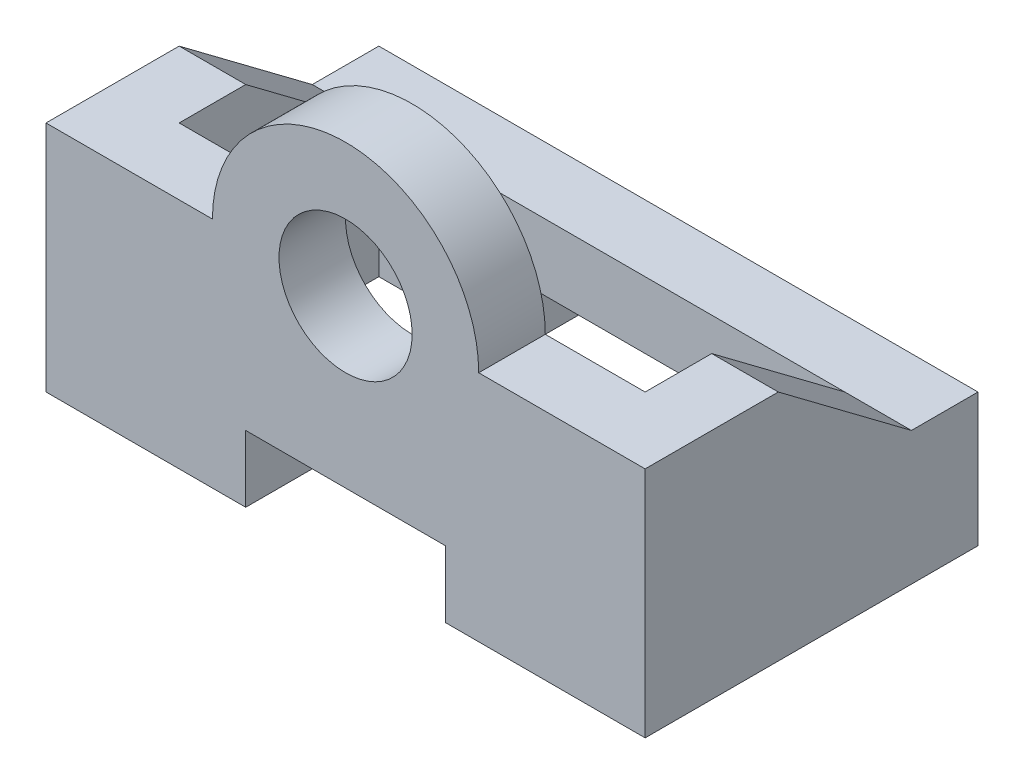
ISO-10303-21;
HEADER;
FILE_DESCRIPTION(('STEP AP214'),'2;1');
FILE_NAME('part.step','',(''),(''),'','','');
FILE_SCHEMA(('AUTOMOTIVE_DESIGN { 1 0 10303 214 1 1 1 1 }'));
ENDSEC;
DATA;
#1=APPLICATION_CONTEXT('core data for automotive mechanical design processes');
#2=APPLICATION_PROTOCOL_DEFINITION('international standard','automotive_design',2000,#1);
#3=PRODUCT_CONTEXT('',#1,'mechanical');
#4=PRODUCT('Part','Part','',(#3));
#5=PRODUCT_RELATED_PRODUCT_CATEGORY('part','',(#4));
#6=PRODUCT_DEFINITION_FORMATION('','',#4);
#7=PRODUCT_DEFINITION_CONTEXT('part definition',#1,'design');
#8=PRODUCT_DEFINITION('design','',#6,#7);
#9=PRODUCT_DEFINITION_SHAPE('','',#8);
#10=(LENGTH_UNIT() NAMED_UNIT(*) SI_UNIT(.MILLI.,.METRE.));
#11=(NAMED_UNIT(*) PLANE_ANGLE_UNIT() SI_UNIT($,.RADIAN.));
#12=(NAMED_UNIT(*) SI_UNIT($,.STERADIAN.) SOLID_ANGLE_UNIT());
#13=UNCERTAINTY_MEASURE_WITH_UNIT(LENGTH_MEASURE(1.E-05),#10,'distance_accuracy_value','');
#14=(GEOMETRIC_REPRESENTATION_CONTEXT(3) GLOBAL_UNCERTAINTY_ASSIGNED_CONTEXT((#13)) GLOBAL_UNIT_ASSIGNED_CONTEXT((#10,
#11,#12)) REPRESENTATION_CONTEXT('',''));
#15=CARTESIAN_POINT('',(0.,0.,0.));
#16=DIRECTION('',(0.,0.,1.));
#17=DIRECTION('',(1.,0.,0.));
#18=AXIS2_PLACEMENT_3D('',#15,#16,#17);
#19=CARTESIAN_POINT('',(35.,0.,-25.));
#20=DIRECTION('',(1.,0.,0.));
#21=DIRECTION('',(0.,0.,-1.));
#22=AXIS2_PLACEMENT_3D('',#19,#20,#21);
#23=PLANE('',#22);
#24=DIRECTION('',(0.,-1.,0.));
#25=VECTOR('',#24,1.);
#26=CARTESIAN_POINT('',(35.,0.,15.));
#27=LINE('',#26,#25);
#28=CARTESIAN_POINT('',(35.,7.5,15.));
#29=VERTEX_POINT('',#28);
#30=CARTESIAN_POINT('',(35.,-27.5,15.));
#31=VERTEX_POINT('',#30);
#32=EDGE_CURVE('E11',#29,#31,#27,.T.);
#33=ORIENTED_EDGE('',*,*,#32,.F.);
#34=DIRECTION('',(0.,0.,1.));
#35=VECTOR('',#34,1.);
#36=CARTESIAN_POINT('',(35.,7.49999999999999,25.));
#37=LINE('',#36,#35);
#38=CARTESIAN_POINT('',(35.,7.49999999999999,5.));
#39=VERTEX_POINT('',#38);
#40=EDGE_CURVE('E132',#39,#29,#37,.T.);
#41=ORIENTED_EDGE('',*,*,#40,.F.);
#42=DIRECTION('',(0.,0.6,0.8));
#43=VECTOR('',#42,1.);
#44=CARTESIAN_POINT('',(35.,7.49999999999999,5.));
#45=LINE('',#44,#43);
#46=CARTESIAN_POINT('',(35.,-7.5,-15.));
#47=VERTEX_POINT('',#46);
#48=EDGE_CURVE('E76',#47,#39,#45,.T.);
#49=ORIENTED_EDGE('',*,*,#48,.F.);
#50=DIRECTION('',(0.,1.,0.));
#51=VECTOR('',#50,1.);
#52=CARTESIAN_POINT('',(35.,0.,-15.));
#53=LINE('',#52,#51);
#54=CARTESIAN_POINT('',(35.,-27.5,-15.));
#55=VERTEX_POINT('',#54);
#56=EDGE_CURVE('E49',#55,#47,#53,.T.);
#57=ORIENTED_EDGE('',*,*,#56,.F.);
#58=DIRECTION('',(0.,0.,-1.));
#59=VECTOR('',#58,1.);
#60=CARTESIAN_POINT('',(35.,-27.5,-25.));
#61=LINE('',#60,#59);
#62=EDGE_CURVE('E136',#31,#55,#61,.T.);
#63=ORIENTED_EDGE('',*,*,#62,.F.);
#64=EDGE_LOOP('',(#33,#41,#49,#57,#63));
#65=FACE_BOUND('',#64,.T.);
#66=ADVANCED_FACE('F41',(#65),#23,.F.);
#67=CARTESIAN_POINT('',(45.,-27.5,-25.));
#68=DIRECTION('',(0.,0.,1.));
#69=DIRECTION('',(1.,0.,0.));
#70=AXIS2_PLACEMENT_3D('',#67,#68,#69);
#71=PLANE('',#70);
#72=DIRECTION('',(-1.,0.,0.));
#73=VECTOR('',#72,1.);
#74=CARTESIAN_POINT('',(45.,-27.5,-25.));
#75=LINE('',#74,#73);
#76=CARTESIAN_POINT('',(45.,-27.5,-25.));
#77=VERTEX_POINT('',#76);
#78=CARTESIAN_POINT('',(15.,-27.5,-25.));
#79=VERTEX_POINT('',#78);
#80=EDGE_CURVE('E127',#77,#79,#75,.T.);
#81=ORIENTED_EDGE('',*,*,#80,.T.);
#82=DIRECTION('',(0.,-1.,0.));
#83=VECTOR('',#82,1.);
#84=CARTESIAN_POINT('',(15.,-27.5,-25.));
#85=LINE('',#84,#83);
#86=CARTESIAN_POINT('',(15.,-17.5,-25.));
#87=VERTEX_POINT('',#86);
#88=EDGE_CURVE('E169',#87,#79,#85,.T.);
#89=ORIENTED_EDGE('',*,*,#88,.F.);
#90=DIRECTION('',(1.,0.,0.));
#91=VECTOR('',#90,1.);
#92=CARTESIAN_POINT('',(-15.,-17.5,-25.));
#93=LINE('',#92,#91);
#94=CARTESIAN_POINT('',(-15.,-17.5,-25.));
#95=VERTEX_POINT('',#94);
#96=EDGE_CURVE('E175',#95,#87,#93,.T.);
#97=ORIENTED_EDGE('',*,*,#96,.F.);
#98=DIRECTION('',(0.,1.,0.));
#99=VECTOR('',#98,1.);
#100=CARTESIAN_POINT('',(-15.,-27.5,-25.));
#101=LINE('',#100,#99);
#102=CARTESIAN_POINT('',(-15.,-27.5,-25.));
#103=VERTEX_POINT('',#102);
#104=EDGE_CURVE('E187',#103,#95,#101,.T.);
#105=ORIENTED_EDGE('',*,*,#104,.F.);
#106=DIRECTION('',(-1.,0.,0.));
#107=VECTOR('',#106,1.);
#108=CARTESIAN_POINT('',(-35.,-27.5,-25.));
#109=LINE('',#108,#107);
#110=CARTESIAN_POINT('',(-45.,-27.5,-25.));
#111=VERTEX_POINT('',#110);
#112=EDGE_CURVE('E216',#103,#111,#109,.T.);
#113=ORIENTED_EDGE('',*,*,#112,.T.);
#114=DIRECTION('',(0.,1.,0.));
#115=VECTOR('',#114,1.);
#116=CARTESIAN_POINT('',(-45.,-27.5,-25.));
#117=LINE('',#116,#115);
#118=CARTESIAN_POINT('',(-45.,-7.5,-25.));
#119=VERTEX_POINT('',#118);
#120=EDGE_CURVE('E205',#111,#119,#117,.T.);
#121=ORIENTED_EDGE('',*,*,#120,.T.);
#122=DIRECTION('',(-1.,0.,0.));
#123=VECTOR('',#122,1.);
#124=CARTESIAN_POINT('',(45.,-7.5,-25.));
#125=LINE('',#124,#123);
#126=CARTESIAN_POINT('',(45.,-7.5,-25.));
#127=VERTEX_POINT('',#126);
#128=EDGE_CURVE('E145',#127,#119,#125,.T.);
#129=ORIENTED_EDGE('',*,*,#128,.F.);
#130=DIRECTION('',(0.,1.,0.));
#131=VECTOR('',#130,1.);
#132=CARTESIAN_POINT('',(45.,-27.5,-25.));
#133=LINE('',#132,#131);
#134=EDGE_CURVE('E138',#77,#127,#133,.T.);
#135=ORIENTED_EDGE('',*,*,#134,.F.);
#136=EDGE_LOOP('',(#81,#89,#97,#105,#113,#121,#129,#135));
#137=FACE_BOUND('',#136,.T.);
#138=ADVANCED_FACE('F43',(#137),#71,.F.);
#139=CARTESIAN_POINT('',(45.,-7.5,-25.));
#140=DIRECTION('',(0.,-1.,0.));
#141=DIRECTION('',(0.,0.,-1.));
#142=AXIS2_PLACEMENT_3D('',#139,#140,#141);
#143=PLANE('',#142);
#144=ORIENTED_EDGE('',*,*,#128,.T.);
#145=DIRECTION('',(0.,0.,1.));
#146=VECTOR('',#145,1.);
#147=CARTESIAN_POINT('',(-45.,-7.5,-25.));
#148=LINE('',#147,#146);
#149=CARTESIAN_POINT('',(-45.,-7.5,-15.));
#150=VERTEX_POINT('',#149);
#151=EDGE_CURVE('E219',#119,#150,#148,.T.);
#152=ORIENTED_EDGE('',*,*,#151,.T.);
#153=DIRECTION('',(-1.,0.,0.));
#154=VECTOR('',#153,1.);
#155=CARTESIAN_POINT('',(-35.,-7.5,-15.));
#156=LINE('',#155,#154);
#157=CARTESIAN_POINT('',(-35.,-7.5,-15.));
#158=VERTEX_POINT('',#157);
#159=EDGE_CURVE('E166',#158,#150,#156,.T.);
#160=ORIENTED_EDGE('',*,*,#159,.F.);
#161=DIRECTION('',(-1.,0.,0.));
#162=VECTOR('',#161,1.);
#163=CARTESIAN_POINT('',(-45.,-7.5,-15.));
#164=LINE('',#163,#162);
#165=EDGE_CURVE('E154',#47,#158,#164,.T.);
#166=ORIENTED_EDGE('',*,*,#165,.F.);
#167=DIRECTION('',(-1.,0.,0.));
#168=VECTOR('',#167,1.);
#169=CARTESIAN_POINT('',(45.,-7.5,-15.));
#170=LINE('',#169,#168);
#171=CARTESIAN_POINT('',(45.,-7.5,-15.));
#172=VERTEX_POINT('',#171);
#173=EDGE_CURVE('E143',#172,#47,#170,.T.);
#174=ORIENTED_EDGE('',*,*,#173,.F.);
#175=DIRECTION('',(0.,0.,1.));
#176=VECTOR('',#175,1.);
#177=CARTESIAN_POINT('',(45.,-7.5,-25.));
#178=LINE('',#177,#176);
#179=EDGE_CURVE('E300',#127,#172,#178,.T.);
#180=ORIENTED_EDGE('',*,*,#179,.F.);
#181=EDGE_LOOP('',(#144,#152,#160,#166,#174,#180));
#182=FACE_BOUND('',#181,.T.);
#183=ADVANCED_FACE('F163',(#182),#143,.F.);
#184=CARTESIAN_POINT('',(45.,7.49999999999999,5.));
#185=DIRECTION('',(0.,-0.8,0.6));
#186=DIRECTION('',(0.,-0.6,-0.8));
#187=AXIS2_PLACEMENT_3D('',#184,#185,#186);
#188=PLANE('',#187);
#189=ORIENTED_EDGE('',*,*,#48,.T.);
#190=DIRECTION('',(-1.,0.,0.));
#191=VECTOR('',#190,1.);
#192=CARTESIAN_POINT('',(45.,7.49999999999999,5.));
#193=LINE('',#192,#191);
#194=CARTESIAN_POINT('',(45.,7.49999999999999,5.));
#195=VERTEX_POINT('',#194);
#196=EDGE_CURVE('E119',#195,#39,#193,.T.);
#197=ORIENTED_EDGE('',*,*,#196,.F.);
#198=DIRECTION('',(0.,0.6,0.8));
#199=VECTOR('',#198,1.);
#200=CARTESIAN_POINT('',(45.,7.49999999999999,5.));
#201=LINE('',#200,#199);
#202=EDGE_CURVE('E105',#172,#195,#201,.T.);
#203=ORIENTED_EDGE('',*,*,#202,.F.);
#204=ORIENTED_EDGE('',*,*,#173,.T.);
#205=EDGE_LOOP('',(#189,#197,#203,#204));
#206=FACE_BOUND('',#205,.T.);
#207=ADVANCED_FACE('F405',(#206),#188,.F.);
#208=CARTESIAN_POINT('',(45.,7.49999999999999,25.));
#209=DIRECTION('',(0.,-1.,0.));
#210=DIRECTION('',(0.,0.,-1.));
#211=AXIS2_PLACEMENT_3D('',#208,#209,#210);
#212=PLANE('',#211);
#213=DIRECTION('',(-1.,0.,0.));
#214=VECTOR('',#213,1.);
#215=CARTESIAN_POINT('',(45.,7.49999999999999,25.));
#216=LINE('',#215,#214);
#217=CARTESIAN_POINT('',(45.,7.49999999999999,25.));
#218=VERTEX_POINT('',#217);
#219=CARTESIAN_POINT('',(20.,7.5,25.));
#220=VERTEX_POINT('',#219);
#221=EDGE_CURVE('E110',#218,#220,#216,.T.);
#222=ORIENTED_EDGE('',*,*,#221,.F.);
#223=DIRECTION('',(0.,0.,1.));
#224=VECTOR('',#223,1.);
#225=CARTESIAN_POINT('',(45.,7.49999999999999,25.));
#226=LINE('',#225,#224);
#227=EDGE_CURVE('E98',#195,#218,#226,.T.);
#228=ORIENTED_EDGE('',*,*,#227,.F.);
#229=ORIENTED_EDGE('',*,*,#196,.T.);
#230=ORIENTED_EDGE('',*,*,#40,.T.);
#231=DIRECTION('',(1.,0.,0.));
#232=VECTOR('',#231,1.);
#233=CARTESIAN_POINT('',(0.,7.5,15.));
#234=LINE('',#233,#232);
#235=CARTESIAN_POINT('',(20.,7.5,15.));
#236=VERTEX_POINT('',#235);
#237=EDGE_CURVE('E236',#236,#29,#234,.T.);
#238=ORIENTED_EDGE('',*,*,#237,.F.);
#239=DIRECTION('',(0.,0.,1.));
#240=VECTOR('',#239,1.);
#241=CARTESIAN_POINT('',(20.,7.5,15.));
#242=LINE('',#241,#240);
#243=EDGE_CURVE('E115',#236,#220,#242,.T.);
#244=ORIENTED_EDGE('',*,*,#243,.T.);
#245=EDGE_LOOP('',(#222,#228,#229,#230,#238,#244));
#246=FACE_BOUND('',#245,.T.);
#247=ADVANCED_FACE('F111',(#246),#212,.F.);
#248=CARTESIAN_POINT('',(45.,-27.5,25.));
#249=DIRECTION('',(0.,0.,-1.));
#250=DIRECTION('',(-1.,0.,0.));
#251=AXIS2_PLACEMENT_3D('',#248,#249,#250);
#252=PLANE('',#251);
#253=ORIENTED_EDGE('',*,*,#221,.T.);
#254=CARTESIAN_POINT('',(0.,7.5,25.));
#255=DIRECTION('',(0.,0.,1.));
#256=DIRECTION('',(1.,0.,0.));
#257=AXIS2_PLACEMENT_3D('',#254,#255,#256);
#258=CIRCLE('',#257,20.);
#259=CARTESIAN_POINT('',(-20.,7.5,25.));
#260=VERTEX_POINT('',#259);
#261=EDGE_CURVE('E259',#220,#260,#258,.T.);
#262=ORIENTED_EDGE('',*,*,#261,.T.);
#263=DIRECTION('',(1.,0.,0.));
#264=VECTOR('',#263,1.);
#265=CARTESIAN_POINT('',(0.,7.5,25.));
#266=LINE('',#265,#264);
#267=CARTESIAN_POINT('',(-45.,7.5,25.));
#268=VERTEX_POINT('',#267);
#269=EDGE_CURVE('E260',#268,#260,#266,.T.);
#270=ORIENTED_EDGE('',*,*,#269,.F.);
#271=DIRECTION('',(0.,1.,0.));
#272=VECTOR('',#271,1.);
#273=CARTESIAN_POINT('',(-45.,0.,25.));
#274=LINE('',#273,#272);
#275=CARTESIAN_POINT('',(-45.,-27.5,25.));
#276=VERTEX_POINT('',#275);
#277=EDGE_CURVE('E263',#276,#268,#274,.T.);
#278=ORIENTED_EDGE('',*,*,#277,.F.);
#279=DIRECTION('',(-1.,0.,0.));
#280=VECTOR('',#279,1.);
#281=CARTESIAN_POINT('',(0.,-27.5,25.));
#282=LINE('',#281,#280);
#283=CARTESIAN_POINT('',(-15.,-27.5,25.));
#284=VERTEX_POINT('',#283);
#285=EDGE_CURVE('E267',#284,#276,#282,.T.);
#286=ORIENTED_EDGE('',*,*,#285,.F.);
#287=DIRECTION('',(0.,-1.,0.));
#288=VECTOR('',#287,1.);
#289=CARTESIAN_POINT('',(-15.,0.,25.));
#290=LINE('',#289,#288);
#291=CARTESIAN_POINT('',(-15.,-17.5,25.));
#292=VERTEX_POINT('',#291);
#293=EDGE_CURVE('E270',#292,#284,#290,.T.);
#294=ORIENTED_EDGE('',*,*,#293,.F.);
#295=DIRECTION('',(-1.,0.,0.));
#296=VECTOR('',#295,1.);
#297=CARTESIAN_POINT('',(0.,-17.5,25.));
#298=LINE('',#297,#296);
#299=CARTESIAN_POINT('',(15.,-17.5,25.));
#300=VERTEX_POINT('',#299);
#301=EDGE_CURVE('E273',#300,#292,#298,.T.);
#302=ORIENTED_EDGE('',*,*,#301,.F.);
#303=DIRECTION('',(0.,1.,0.));
#304=VECTOR('',#303,1.);
#305=CARTESIAN_POINT('',(15.,0.,25.));
#306=LINE('',#305,#304);
#307=CARTESIAN_POINT('',(15.,-27.5,25.));
#308=VERTEX_POINT('',#307);
#309=EDGE_CURVE('E237',#308,#300,#306,.T.);
#310=ORIENTED_EDGE('',*,*,#309,.F.);
#311=DIRECTION('',(-1.,0.,0.));
#312=VECTOR('',#311,1.);
#313=CARTESIAN_POINT('',(45.,-27.5,25.));
#314=LINE('',#313,#312);
#315=CARTESIAN_POINT('',(45.,-27.5,25.));
#316=VERTEX_POINT('',#315);
#317=EDGE_CURVE('E120',#316,#308,#314,.T.);
#318=ORIENTED_EDGE('',*,*,#317,.F.);
#319=DIRECTION('',(0.,-1.,0.));
#320=VECTOR('',#319,1.);
#321=CARTESIAN_POINT('',(45.,-27.5,25.));
#322=LINE('',#321,#320);
#323=EDGE_CURVE('E102',#218,#316,#322,.T.);
#324=ORIENTED_EDGE('',*,*,#323,.F.);
#325=EDGE_LOOP('',(#253,#262,#270,#278,#286,#294,#302,#310,#318,#324));
#326=FACE_BOUND('',#325,.T.);
#327=CARTESIAN_POINT('',(0.,7.5,25.));
#328=DIRECTION('',(0.,0.,1.));
#329=DIRECTION('',(1.,0.,0.));
#330=AXIS2_PLACEMENT_3D('',#327,#328,#329);
#331=CIRCLE('',#330,10.);
#332=CARTESIAN_POINT('',(10.,7.5,25.));
#333=VERTEX_POINT('',#332);
#334=EDGE_CURVE('E232',#333,#333,#331,.T.);
#335=ORIENTED_EDGE('',*,*,#334,.F.);
#336=EDGE_LOOP('',(#335));
#337=FACE_BOUND('',#336,.T.);
#338=ADVANCED_FACE('F122',(#326,#337),#252,.F.);
#339=CARTESIAN_POINT('',(45.,-27.5,-25.));
#340=DIRECTION('',(0.,1.,0.));
#341=DIRECTION('',(0.,0.,1.));
#342=AXIS2_PLACEMENT_3D('',#339,#340,#341);
#343=PLANE('',#342);
#344=ORIENTED_EDGE('',*,*,#80,.F.);
#345=DIRECTION('',(0.,0.,-1.));
#346=VECTOR('',#345,1.);
#347=CARTESIAN_POINT('',(45.,-27.5,-25.));
#348=LINE('',#347,#346);
#349=EDGE_CURVE('E64',#316,#77,#348,.T.);
#350=ORIENTED_EDGE('',*,*,#349,.F.);
#351=ORIENTED_EDGE('',*,*,#317,.T.);
#352=DIRECTION('',(0.,0.,1.));
#353=VECTOR('',#352,1.);
#354=CARTESIAN_POINT('',(15.,-27.5,15.));
#355=LINE('',#354,#353);
#356=CARTESIAN_POINT('',(15.,-27.5,15.));
#357=VERTEX_POINT('',#356);
#358=EDGE_CURVE('E133',#357,#308,#355,.T.);
#359=ORIENTED_EDGE('',*,*,#358,.F.);
#360=DIRECTION('',(-1.,0.,0.));
#361=VECTOR('',#360,1.);
#362=CARTESIAN_POINT('',(0.,-27.5,15.));
#363=LINE('',#362,#361);
#364=EDGE_CURVE('E255',#31,#357,#363,.T.);
#365=ORIENTED_EDGE('',*,*,#364,.F.);
#366=ORIENTED_EDGE('',*,*,#62,.T.);
#367=DIRECTION('',(1.,0.,0.));
#368=VECTOR('',#367,1.);
#369=CARTESIAN_POINT('',(45.,-27.5,-15.));
#370=LINE('',#369,#368);
#371=CARTESIAN_POINT('',(15.,-27.5,-15.));
#372=VERTEX_POINT('',#371);
#373=EDGE_CURVE('E158',#372,#55,#370,.T.);
#374=ORIENTED_EDGE('',*,*,#373,.F.);
#375=DIRECTION('',(0.,0.,-1.));
#376=VECTOR('',#375,1.);
#377=CARTESIAN_POINT('',(15.,-27.5,-15.));
#378=LINE('',#377,#376);
#379=EDGE_CURVE('E186',#372,#79,#378,.T.);
#380=ORIENTED_EDGE('',*,*,#379,.T.);
#381=EDGE_LOOP('',(#344,#350,#351,#359,#365,#366,#374,#380));
#382=FACE_BOUND('',#381,.T.);
#383=ADVANCED_FACE('F421',(#382),#343,.F.);
#384=CARTESIAN_POINT('',(45.,0.,-25.));
#385=DIRECTION('',(1.,0.,0.));
#386=DIRECTION('',(0.,0.,-1.));
#387=AXIS2_PLACEMENT_3D('',#384,#385,#386);
#388=PLANE('',#387);
#389=ORIENTED_EDGE('',*,*,#179,.T.);
#390=ORIENTED_EDGE('',*,*,#202,.T.);
#391=ORIENTED_EDGE('',*,*,#227,.T.);
#392=ORIENTED_EDGE('',*,*,#323,.T.);
#393=ORIENTED_EDGE('',*,*,#349,.T.);
#394=ORIENTED_EDGE('',*,*,#134,.T.);
#395=EDGE_LOOP('',(#389,#390,#391,#392,#393,#394));
#396=FACE_BOUND('',#395,.T.);
#397=ADVANCED_FACE('F100',(#396),#388,.T.);
#398=CARTESIAN_POINT('',(0.,0.,15.));
#399=DIRECTION('',(0.,0.,1.));
#400=DIRECTION('',(1.,0.,0.));
#401=AXIS2_PLACEMENT_3D('',#398,#399,#400);
#402=PLANE('',#401);
#403=CARTESIAN_POINT('',(0.,7.5,15.));
#404=DIRECTION('',(0.,0.,1.));
#405=DIRECTION('',(1.,0.,0.));
#406=AXIS2_PLACEMENT_3D('',#403,#404,#405);
#407=CIRCLE('',#406,10.);
#408=CARTESIAN_POINT('',(10.,7.5,15.));
#409=VERTEX_POINT('',#408);
#410=EDGE_CURVE('E233',#409,#409,#407,.T.);
#411=ORIENTED_EDGE('',*,*,#410,.T.);
#412=EDGE_LOOP('',(#411));
#413=FACE_BOUND('',#412,.T.);
#414=ORIENTED_EDGE('',*,*,#237,.T.);
#415=ORIENTED_EDGE('',*,*,#32,.T.);
#416=ORIENTED_EDGE('',*,*,#364,.T.);
#417=DIRECTION('',(0.,1.,0.));
#418=VECTOR('',#417,1.);
#419=CARTESIAN_POINT('',(15.,0.,15.));
#420=LINE('',#419,#418);
#421=CARTESIAN_POINT('',(15.,-17.5,15.));
#422=VERTEX_POINT('',#421);
#423=EDGE_CURVE('E252',#357,#422,#420,.T.);
#424=ORIENTED_EDGE('',*,*,#423,.T.);
#425=DIRECTION('',(-1.,0.,0.));
#426=VECTOR('',#425,1.);
#427=CARTESIAN_POINT('',(0.,-17.5,15.));
#428=LINE('',#427,#426);
#429=CARTESIAN_POINT('',(-15.,-17.5,15.));
#430=VERTEX_POINT('',#429);
#431=EDGE_CURVE('E249',#422,#430,#428,.T.);
#432=ORIENTED_EDGE('',*,*,#431,.T.);
#433=DIRECTION('',(0.,-1.,0.));
#434=VECTOR('',#433,1.);
#435=CARTESIAN_POINT('',(-15.,0.,15.));
#436=LINE('',#435,#434);
#437=CARTESIAN_POINT('',(-15.,-27.5,15.));
#438=VERTEX_POINT('',#437);
#439=EDGE_CURVE('E246',#430,#438,#436,.T.);
#440=ORIENTED_EDGE('',*,*,#439,.T.);
#441=DIRECTION('',(-1.,0.,0.));
#442=VECTOR('',#441,1.);
#443=CARTESIAN_POINT('',(0.,-27.5,15.));
#444=LINE('',#443,#442);
#445=CARTESIAN_POINT('',(-35.,-27.5,15.));
#446=VERTEX_POINT('',#445);
#447=EDGE_CURVE('E243',#438,#446,#444,.T.);
#448=ORIENTED_EDGE('',*,*,#447,.T.);
#449=DIRECTION('',(0.,1.,0.));
#450=VECTOR('',#449,1.);
#451=CARTESIAN_POINT('',(-35.,0.,15.));
#452=LINE('',#451,#450);
#453=CARTESIAN_POINT('',(-35.,7.5,15.));
#454=VERTEX_POINT('',#453);
#455=EDGE_CURVE('E229',#446,#454,#452,.T.);
#456=ORIENTED_EDGE('',*,*,#455,.T.);
#457=CARTESIAN_POINT('',(-20.,7.5,15.));
#458=VERTEX_POINT('',#457);
#459=EDGE_CURVE('E240',#454,#458,#234,.T.);
#460=ORIENTED_EDGE('',*,*,#459,.T.);
#461=CARTESIAN_POINT('',(0.,7.5,15.));
#462=DIRECTION('',(0.,0.,1.));
#463=DIRECTION('',(1.,0.,0.));
#464=AXIS2_PLACEMENT_3D('',#461,#462,#463);
#465=CIRCLE('',#464,20.);
#466=EDGE_CURVE('E239',#236,#458,#465,.T.);
#467=ORIENTED_EDGE('',*,*,#466,.F.);
#468=EDGE_LOOP('',(#414,#415,#416,#424,#432,#440,#448,#456,#460,#467));
#469=FACE_BOUND('',#468,.T.);
#470=ADVANCED_FACE('F386',(#413,#469),#402,.F.);
#471=CARTESIAN_POINT('',(0.,0.,-15.));
#472=DIRECTION('',(0.,0.,-1.));
#473=DIRECTION('',(-1.,0.,0.));
#474=AXIS2_PLACEMENT_3D('',#471,#472,#473);
#475=PLANE('',#474);
#476=ORIENTED_EDGE('',*,*,#373,.T.);
#477=ORIENTED_EDGE('',*,*,#56,.T.);
#478=ORIENTED_EDGE('',*,*,#165,.T.);
#479=DIRECTION('',(0.,1.,0.));
#480=VECTOR('',#479,1.);
#481=CARTESIAN_POINT('',(-35.,0.,-15.));
#482=LINE('',#481,#480);
#483=CARTESIAN_POINT('',(-35.,-27.5,-15.));
#484=VERTEX_POINT('',#483);
#485=EDGE_CURVE('E203',#484,#158,#482,.T.);
#486=ORIENTED_EDGE('',*,*,#485,.F.);
#487=DIRECTION('',(1.,0.,0.));
#488=VECTOR('',#487,1.);
#489=CARTESIAN_POINT('',(-45.,-27.5,-15.));
#490=LINE('',#489,#488);
#491=CARTESIAN_POINT('',(-15.,-27.5,-15.));
#492=VERTEX_POINT('',#491);
#493=EDGE_CURVE('E168',#484,#492,#490,.T.);
#494=ORIENTED_EDGE('',*,*,#493,.T.);
#495=DIRECTION('',(0.,1.,0.));
#496=VECTOR('',#495,1.);
#497=CARTESIAN_POINT('',(-15.,-27.5,-15.));
#498=LINE('',#497,#496);
#499=CARTESIAN_POINT('',(-15.,-17.5,-15.));
#500=VERTEX_POINT('',#499);
#501=EDGE_CURVE('E172',#492,#500,#498,.T.);
#502=ORIENTED_EDGE('',*,*,#501,.T.);
#503=DIRECTION('',(1.,0.,0.));
#504=VECTOR('',#503,1.);
#505=CARTESIAN_POINT('',(-15.,-17.5,-15.));
#506=LINE('',#505,#504);
#507=CARTESIAN_POINT('',(15.,-17.5,-15.));
#508=VERTEX_POINT('',#507);
#509=EDGE_CURVE('E180',#500,#508,#506,.T.);
#510=ORIENTED_EDGE('',*,*,#509,.T.);
#511=DIRECTION('',(0.,-1.,0.));
#512=VECTOR('',#511,1.);
#513=CARTESIAN_POINT('',(15.,-27.5,-15.));
#514=LINE('',#513,#512);
#515=EDGE_CURVE('E183',#508,#372,#514,.T.);
#516=ORIENTED_EDGE('',*,*,#515,.T.);
#517=EDGE_LOOP('',(#476,#477,#478,#486,#494,#502,#510,#516));
#518=FACE_BOUND('',#517,.T.);
#519=ADVANCED_FACE('F151',(#518),#475,.F.);
#520=CARTESIAN_POINT('',(15.,0.,15.));
#521=DIRECTION('',(1.,0.,0.));
#522=DIRECTION('',(0.,0.,-1.));
#523=AXIS2_PLACEMENT_3D('',#520,#521,#522);
#524=PLANE('',#523);
#525=ORIENTED_EDGE('',*,*,#309,.T.);
#526=DIRECTION('',(0.,0.,1.));
#527=VECTOR('',#526,1.);
#528=CARTESIAN_POINT('',(15.,-17.5,15.));
#529=LINE('',#528,#527);
#530=EDGE_CURVE('E280',#422,#300,#529,.T.);
#531=ORIENTED_EDGE('',*,*,#530,.F.);
#532=ORIENTED_EDGE('',*,*,#423,.F.);
#533=ORIENTED_EDGE('',*,*,#358,.T.);
#534=EDGE_LOOP('',(#525,#531,#532,#533));
#535=FACE_BOUND('',#534,.T.);
#536=ADVANCED_FACE('F452',(#535),#524,.F.);
#537=CARTESIAN_POINT('',(0.,-17.5,15.));
#538=DIRECTION('',(0.,1.,0.));
#539=DIRECTION('',(0.,0.,1.));
#540=AXIS2_PLACEMENT_3D('',#537,#538,#539);
#541=PLANE('',#540);
#542=ORIENTED_EDGE('',*,*,#301,.T.);
#543=DIRECTION('',(0.,0.,1.));
#544=VECTOR('',#543,1.);
#545=CARTESIAN_POINT('',(-15.,-17.5,15.));
#546=LINE('',#545,#544);
#547=EDGE_CURVE('E283',#430,#292,#546,.T.);
#548=ORIENTED_EDGE('',*,*,#547,.F.);
#549=ORIENTED_EDGE('',*,*,#431,.F.);
#550=ORIENTED_EDGE('',*,*,#530,.T.);
#551=EDGE_LOOP('',(#542,#548,#549,#550));
#552=FACE_BOUND('',#551,.T.);
#553=ADVANCED_FACE('F459',(#552),#541,.F.);
#554=CARTESIAN_POINT('',(-15.,0.,15.));
#555=DIRECTION('',(-1.,0.,0.));
#556=DIRECTION('',(0.,0.,1.));
#557=AXIS2_PLACEMENT_3D('',#554,#555,#556);
#558=PLANE('',#557);
#559=ORIENTED_EDGE('',*,*,#293,.T.);
#560=DIRECTION('',(0.,0.,1.));
#561=VECTOR('',#560,1.);
#562=CARTESIAN_POINT('',(-15.,-27.5,15.));
#563=LINE('',#562,#561);
#564=EDGE_CURVE('E286',#438,#284,#563,.T.);
#565=ORIENTED_EDGE('',*,*,#564,.F.);
#566=ORIENTED_EDGE('',*,*,#439,.F.);
#567=ORIENTED_EDGE('',*,*,#547,.T.);
#568=EDGE_LOOP('',(#559,#565,#566,#567));
#569=FACE_BOUND('',#568,.T.);
#570=ADVANCED_FACE('F467',(#569),#558,.F.);
#571=CARTESIAN_POINT('',(0.,-27.5,15.));
#572=DIRECTION('',(0.,1.,0.));
#573=DIRECTION('',(0.,0.,1.));
#574=AXIS2_PLACEMENT_3D('',#571,#572,#573);
#575=PLANE('',#574);
#576=ORIENTED_EDGE('',*,*,#285,.T.);
#577=DIRECTION('',(0.,0.,1.));
#578=VECTOR('',#577,1.);
#579=CARTESIAN_POINT('',(-45.,-27.5,15.));
#580=LINE('',#579,#578);
#581=EDGE_CURVE('E289',#111,#276,#580,.T.);
#582=ORIENTED_EDGE('',*,*,#581,.F.);
#583=ORIENTED_EDGE('',*,*,#112,.F.);
#584=DIRECTION('',(0.,0.,-1.));
#585=VECTOR('',#584,1.);
#586=CARTESIAN_POINT('',(-15.,-27.5,-15.));
#587=LINE('',#586,#585);
#588=EDGE_CURVE('E200',#492,#103,#587,.T.);
#589=ORIENTED_EDGE('',*,*,#588,.F.);
#590=ORIENTED_EDGE('',*,*,#493,.F.);
#591=DIRECTION('',(0.,0.,-1.));
#592=VECTOR('',#591,1.);
#593=CARTESIAN_POINT('',(-35.,-27.5,-25.));
#594=LINE('',#593,#592);
#595=EDGE_CURVE('E213',#446,#484,#594,.T.);
#596=ORIENTED_EDGE('',*,*,#595,.F.);
#597=ORIENTED_EDGE('',*,*,#447,.F.);
#598=ORIENTED_EDGE('',*,*,#564,.T.);
#599=EDGE_LOOP('',(#576,#582,#583,#589,#590,#596,#597,#598));
#600=FACE_BOUND('',#599,.T.);
#601=ADVANCED_FACE('F324',(#600),#575,.F.);
#602=CARTESIAN_POINT('',(-45.,0.,15.));
#603=DIRECTION('',(1.,0.,0.));
#604=DIRECTION('',(0.,0.,-1.));
#605=AXIS2_PLACEMENT_3D('',#602,#603,#604);
#606=PLANE('',#605);
#607=ORIENTED_EDGE('',*,*,#277,.T.);
#608=DIRECTION('',(0.,0.,1.));
#609=VECTOR('',#608,1.);
#610=CARTESIAN_POINT('',(-45.,7.5,15.));
#611=LINE('',#610,#609);
#612=CARTESIAN_POINT('',(-45.,7.49999999999999,5.));
#613=VERTEX_POINT('',#612);
#614=EDGE_CURVE('E292',#613,#268,#611,.T.);
#615=ORIENTED_EDGE('',*,*,#614,.F.);
#616=DIRECTION('',(0.,0.6,0.8));
#617=VECTOR('',#616,1.);
#618=CARTESIAN_POINT('',(-45.,7.49999999999999,5.));
#619=LINE('',#618,#617);
#620=EDGE_CURVE('E210',#150,#613,#619,.T.);
#621=ORIENTED_EDGE('',*,*,#620,.F.);
#622=ORIENTED_EDGE('',*,*,#151,.F.);
#623=ORIENTED_EDGE('',*,*,#120,.F.);
#624=ORIENTED_EDGE('',*,*,#581,.T.);
#625=EDGE_LOOP('',(#607,#615,#621,#622,#623,#624));
#626=FACE_BOUND('',#625,.T.);
#627=ADVANCED_FACE('F312',(#626),#606,.F.);
#628=CARTESIAN_POINT('',(0.,7.5,15.));
#629=DIRECTION('',(0.,-1.,0.));
#630=DIRECTION('',(0.,0.,-1.));
#631=AXIS2_PLACEMENT_3D('',#628,#629,#630);
#632=PLANE('',#631);
#633=ORIENTED_EDGE('',*,*,#459,.F.);
#634=DIRECTION('',(0.,0.,1.));
#635=VECTOR('',#634,1.);
#636=CARTESIAN_POINT('',(-35.,7.49999999999999,25.));
#637=LINE('',#636,#635);
#638=CARTESIAN_POINT('',(-35.,7.49999999999999,5.));
#639=VERTEX_POINT('',#638);
#640=EDGE_CURVE('E209',#639,#454,#637,.T.);
#641=ORIENTED_EDGE('',*,*,#640,.F.);
#642=DIRECTION('',(-1.,0.,0.));
#643=VECTOR('',#642,1.);
#644=CARTESIAN_POINT('',(-35.,7.49999999999999,5.));
#645=LINE('',#644,#643);
#646=EDGE_CURVE('E225',#639,#613,#645,.T.);
#647=ORIENTED_EDGE('',*,*,#646,.T.);
#648=ORIENTED_EDGE('',*,*,#614,.T.);
#649=ORIENTED_EDGE('',*,*,#269,.T.);
#650=DIRECTION('',(0.,0.,1.));
#651=VECTOR('',#650,1.);
#652=CARTESIAN_POINT('',(-20.,7.5,15.));
#653=LINE('',#652,#651);
#654=EDGE_CURVE('E295',#458,#260,#653,.T.);
#655=ORIENTED_EDGE('',*,*,#654,.F.);
#656=EDGE_LOOP('',(#633,#641,#647,#648,#649,#655));
#657=FACE_BOUND('',#656,.T.);
#658=ADVANCED_FACE('F394',(#657),#632,.F.);
#659=CARTESIAN_POINT('',(0.,7.5,15.));
#660=DIRECTION('',(0.,0.,1.));
#661=DIRECTION('',(1.,0.,0.));
#662=AXIS2_PLACEMENT_3D('',#659,#660,#661);
#663=CYLINDRICAL_SURFACE('',#662,10.);
#664=ORIENTED_EDGE('',*,*,#410,.F.);
#665=EDGE_LOOP('',(#664));
#666=FACE_BOUND('',#665,.T.);
#667=ORIENTED_EDGE('',*,*,#334,.T.);
#668=EDGE_LOOP('',(#667));
#669=FACE_BOUND('',#668,.T.);
#670=ADVANCED_FACE('F494',(#666,#669),#663,.F.);
#671=CARTESIAN_POINT('',(0.,7.5,15.));
#672=DIRECTION('',(0.,0.,1.));
#673=DIRECTION('',(1.,0.,0.));
#674=AXIS2_PLACEMENT_3D('',#671,#672,#673);
#675=CYLINDRICAL_SURFACE('',#674,20.);
#676=ORIENTED_EDGE('',*,*,#261,.F.);
#677=ORIENTED_EDGE('',*,*,#243,.F.);
#678=ORIENTED_EDGE('',*,*,#466,.T.);
#679=ORIENTED_EDGE('',*,*,#654,.T.);
#680=EDGE_LOOP('',(#676,#677,#678,#679));
#681=FACE_BOUND('',#680,.T.);
#682=ADVANCED_FACE('F403',(#681),#675,.T.);
#683=CARTESIAN_POINT('',(-35.,0.,-25.));
#684=DIRECTION('',(1.,0.,0.));
#685=DIRECTION('',(0.,0.,-1.));
#686=AXIS2_PLACEMENT_3D('',#683,#684,#685);
#687=PLANE('',#686);
#688=ORIENTED_EDGE('',*,*,#455,.F.);
#689=ORIENTED_EDGE('',*,*,#595,.T.);
#690=ORIENTED_EDGE('',*,*,#485,.T.);
#691=DIRECTION('',(0.,0.6,0.8));
#692=VECTOR('',#691,1.);
#693=CARTESIAN_POINT('',(-35.,7.49999999999999,5.));
#694=LINE('',#693,#692);
#695=EDGE_CURVE('E206',#158,#639,#694,.T.);
#696=ORIENTED_EDGE('',*,*,#695,.T.);
#697=ORIENTED_EDGE('',*,*,#640,.T.);
#698=EDGE_LOOP('',(#688,#689,#690,#696,#697));
#699=FACE_BOUND('',#698,.T.);
#700=ADVANCED_FACE('F395',(#699),#687,.T.);
#701=CARTESIAN_POINT('',(-35.,7.49999999999999,5.));
#702=DIRECTION('',(0.,-0.8,0.6));
#703=DIRECTION('',(0.,-0.6,-0.8));
#704=AXIS2_PLACEMENT_3D('',#701,#702,#703);
#705=PLANE('',#704);
#706=ORIENTED_EDGE('',*,*,#620,.T.);
#707=ORIENTED_EDGE('',*,*,#646,.F.);
#708=ORIENTED_EDGE('',*,*,#695,.F.);
#709=ORIENTED_EDGE('',*,*,#159,.T.);
#710=EDGE_LOOP('',(#706,#707,#708,#709));
#711=FACE_BOUND('',#710,.T.);
#712=ADVANCED_FACE('F398',(#711),#705,.F.);
#713=CARTESIAN_POINT('',(-15.,-27.5,-15.));
#714=DIRECTION('',(-1.,0.,0.));
#715=DIRECTION('',(0.,0.,1.));
#716=AXIS2_PLACEMENT_3D('',#713,#714,#715);
#717=PLANE('',#716);
#718=ORIENTED_EDGE('',*,*,#104,.T.);
#719=DIRECTION('',(0.,0.,-1.));
#720=VECTOR('',#719,1.);
#721=CARTESIAN_POINT('',(-15.,-17.5,-15.));
#722=LINE('',#721,#720);
#723=EDGE_CURVE('E197',#500,#95,#722,.T.);
#724=ORIENTED_EDGE('',*,*,#723,.F.);
#725=ORIENTED_EDGE('',*,*,#501,.F.);
#726=ORIENTED_EDGE('',*,*,#588,.T.);
#727=EDGE_LOOP('',(#718,#724,#725,#726));
#728=FACE_BOUND('',#727,.T.);
#729=ADVANCED_FACE('F331',(#728),#717,.F.);
#730=CARTESIAN_POINT('',(-15.,-17.5,-15.));
#731=DIRECTION('',(0.,1.,0.));
#732=DIRECTION('',(0.,0.,1.));
#733=AXIS2_PLACEMENT_3D('',#730,#731,#732);
#734=PLANE('',#733);
#735=ORIENTED_EDGE('',*,*,#96,.T.);
#736=DIRECTION('',(0.,0.,-1.));
#737=VECTOR('',#736,1.);
#738=CARTESIAN_POINT('',(15.,-17.5,-15.));
#739=LINE('',#738,#737);
#740=EDGE_CURVE('E194',#508,#87,#739,.T.);
#741=ORIENTED_EDGE('',*,*,#740,.F.);
#742=ORIENTED_EDGE('',*,*,#509,.F.);
#743=ORIENTED_EDGE('',*,*,#723,.T.);
#744=EDGE_LOOP('',(#735,#741,#742,#743));
#745=FACE_BOUND('',#744,.T.);
#746=ADVANCED_FACE('F525',(#745),#734,.F.);
#747=CARTESIAN_POINT('',(15.,-27.5,-15.));
#748=DIRECTION('',(1.,0.,0.));
#749=DIRECTION('',(0.,0.,-1.));
#750=AXIS2_PLACEMENT_3D('',#747,#748,#749);
#751=PLANE('',#750);
#752=ORIENTED_EDGE('',*,*,#88,.T.);
#753=ORIENTED_EDGE('',*,*,#379,.F.);
#754=ORIENTED_EDGE('',*,*,#515,.F.);
#755=ORIENTED_EDGE('',*,*,#740,.T.);
#756=EDGE_LOOP('',(#752,#753,#754,#755));
#757=FACE_BOUND('',#756,.T.);
#758=ADVANCED_FACE('F532',(#757),#751,.F.);
#759=CLOSED_SHELL('',(#66,#138,#183,#207,#247,#338,#383,#397,#470,#519,#536,#553,#570,#601,#627,
#658,#670,#682,#700,#712,#729,#746,#758));
#760=MANIFOLD_SOLID_BREP('B2',#759);
#761=ADVANCED_BREP_SHAPE_REPRESENTATION('',(#18,#760),#14);
#762=SHAPE_DEFINITION_REPRESENTATION(#9,#761);
ENDSEC;
END-ISO-10303-21;
